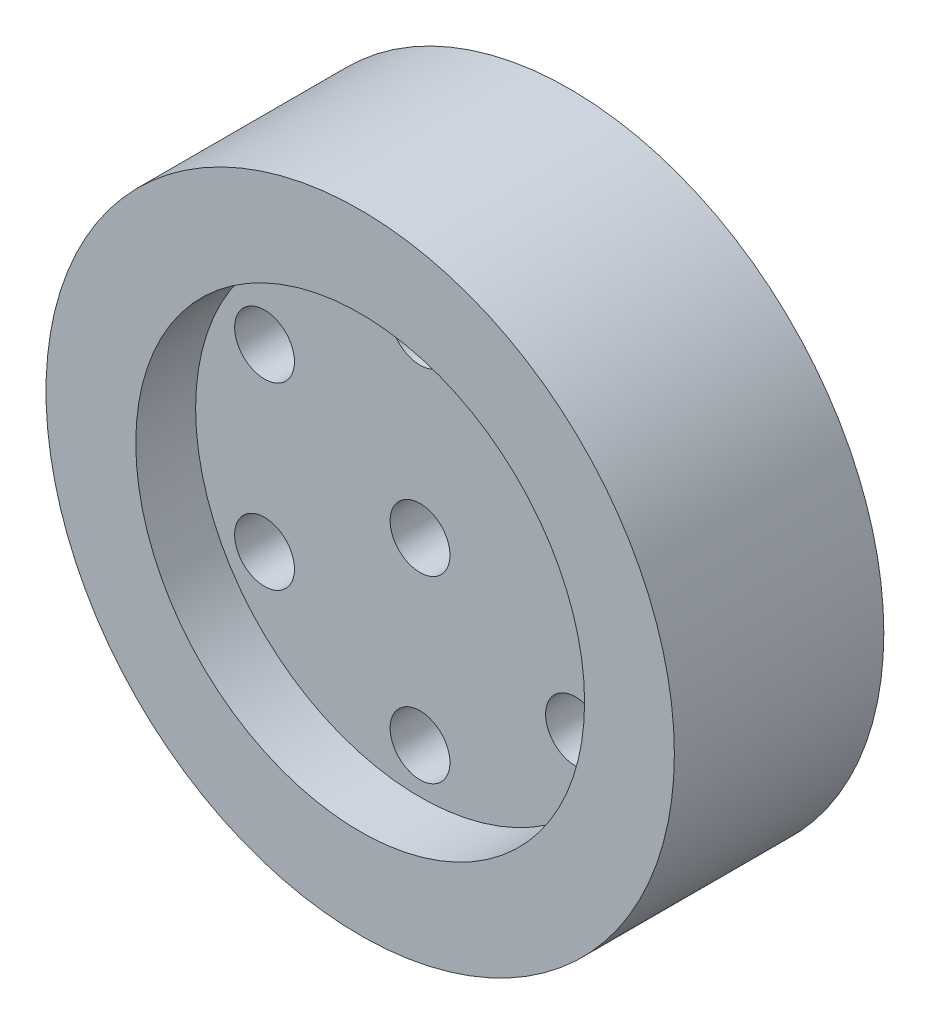
ISO-10303-21;
HEADER;
FILE_DESCRIPTION(('STEP AP214'),'2;1');
FILE_NAME('part.step','',(''),(''),'','','');
FILE_SCHEMA(('AUTOMOTIVE_DESIGN { 1 0 10303 214 1 1 1 1 }'));
ENDSEC;
DATA;
#1=APPLICATION_CONTEXT('core data for automotive mechanical design processes');
#2=APPLICATION_PROTOCOL_DEFINITION('international standard','automotive_design',2000,#1);
#3=PRODUCT_CONTEXT('',#1,'mechanical');
#4=PRODUCT('Part','Part','',(#3));
#5=PRODUCT_RELATED_PRODUCT_CATEGORY('part','',(#4));
#6=PRODUCT_DEFINITION_FORMATION('','',#4);
#7=PRODUCT_DEFINITION_CONTEXT('part definition',#1,'design');
#8=PRODUCT_DEFINITION('design','',#6,#7);
#9=PRODUCT_DEFINITION_SHAPE('','',#8);
#10=(LENGTH_UNIT() NAMED_UNIT(*) SI_UNIT(.MILLI.,.METRE.));
#11=(NAMED_UNIT(*) PLANE_ANGLE_UNIT() SI_UNIT($,.RADIAN.));
#12=(NAMED_UNIT(*) SI_UNIT($,.STERADIAN.) SOLID_ANGLE_UNIT());
#13=UNCERTAINTY_MEASURE_WITH_UNIT(LENGTH_MEASURE(1.E-05),#10,'distance_accuracy_value','');
#14=(GEOMETRIC_REPRESENTATION_CONTEXT(3) GLOBAL_UNCERTAINTY_ASSIGNED_CONTEXT((#13)) GLOBAL_UNIT_ASSIGNED_CONTEXT((#10,
#11,#12)) REPRESENTATION_CONTEXT('',''));
#15=CARTESIAN_POINT('',(0.,0.,0.));
#16=DIRECTION('',(0.,0.,1.));
#17=DIRECTION('',(1.,0.,0.));
#18=AXIS2_PLACEMENT_3D('',#15,#16,#17);
#19=CARTESIAN_POINT('',(10.3923048454134,6.0000000000003,-7.));
#20=DIRECTION('',(0.,0.,1.));
#21=DIRECTION('',(1.,0.,0.));
#22=AXIS2_PLACEMENT_3D('',#19,#20,#21);
#23=CYLINDRICAL_SURFACE('',#22,2.00000000000011);
#24=CARTESIAN_POINT('',(10.3923048454134,6.0000000000003,3.));
#25=DIRECTION('',(0.,0.,1.));
#26=DIRECTION('',(1.,0.,0.));
#27=AXIS2_PLACEMENT_3D('',#24,#25,#26);
#28=CIRCLE('',#27,2.00000000000011);
#29=CARTESIAN_POINT('',(12.3923048454135,6.0000000000003,3.));
#30=VERTEX_POINT('',#29);
#31=EDGE_CURVE('E77',#30,#30,#28,.T.);
#32=ORIENTED_EDGE('',*,*,#31,.T.);
#33=EDGE_LOOP('',(#32));
#34=FACE_BOUND('',#33,.T.);
#35=CARTESIAN_POINT('',(10.3923048454134,6.0000000000003,-3.));
#36=DIRECTION('',(0.,0.,-1.));
#37=DIRECTION('',(-1.,0.,0.));
#38=AXIS2_PLACEMENT_3D('',#35,#36,#37);
#39=CIRCLE('',#38,2.00000000000011);
#40=CARTESIAN_POINT('',(8.39230484541332,6.0000000000003,-3.));
#41=VERTEX_POINT('',#40);
#42=EDGE_CURVE('E84',#41,#41,#39,.F.);
#43=ORIENTED_EDGE('',*,*,#42,.F.);
#44=EDGE_LOOP('',(#43));
#45=FACE_BOUND('',#44,.T.);
#46=ADVANCED_FACE('F39',(#34,#45),#23,.F.);
#47=CARTESIAN_POINT('',(10.3923048454138,-5.99999999999971,-7.));
#48=DIRECTION('',(0.,0.,1.));
#49=DIRECTION('',(1.,0.,0.));
#50=AXIS2_PLACEMENT_3D('',#47,#48,#49);
#51=CYLINDRICAL_SURFACE('',#50,2.00000000000046);
#52=CARTESIAN_POINT('',(10.3923048454138,-5.99999999999971,3.));
#53=DIRECTION('',(0.,0.,1.));
#54=DIRECTION('',(1.,0.,0.));
#55=AXIS2_PLACEMENT_3D('',#52,#53,#54);
#56=CIRCLE('',#55,2.00000000000046);
#57=CARTESIAN_POINT('',(12.3923048454142,-5.99999999999971,3.));
#58=VERTEX_POINT('',#57);
#59=EDGE_CURVE('E73',#58,#58,#56,.T.);
#60=ORIENTED_EDGE('',*,*,#59,.T.);
#61=EDGE_LOOP('',(#60));
#62=FACE_BOUND('',#61,.T.);
#63=CARTESIAN_POINT('',(10.3923048454138,-5.99999999999971,-3.));
#64=DIRECTION('',(0.,0.,-1.));
#65=DIRECTION('',(-1.,0.,0.));
#66=AXIS2_PLACEMENT_3D('',#63,#64,#65);
#67=CIRCLE('',#66,2.00000000000046);
#68=CARTESIAN_POINT('',(8.39230484541332,-5.99999999999971,-3.));
#69=VERTEX_POINT('',#68);
#70=EDGE_CURVE('E91',#69,#69,#67,.F.);
#71=ORIENTED_EDGE('',*,*,#70,.F.);
#72=EDGE_LOOP('',(#71));
#73=FACE_BOUND('',#72,.T.);
#74=ADVANCED_FACE('F168',(#62,#73),#51,.F.);
#75=CARTESIAN_POINT('',(6.77712297852766E-13,-12.,-7.));
#76=DIRECTION('',(0.,0.,1.));
#77=DIRECTION('',(1.,0.,0.));
#78=AXIS2_PLACEMENT_3D('',#75,#76,#77);
#79=CYLINDRICAL_SURFACE('',#78,2.00000000000073);
#80=CARTESIAN_POINT('',(6.77712297852766E-13,-12.,3.));
#81=DIRECTION('',(0.,0.,1.));
#82=DIRECTION('',(1.,0.,0.));
#83=AXIS2_PLACEMENT_3D('',#80,#81,#82);
#84=CIRCLE('',#83,2.00000000000073);
#85=CARTESIAN_POINT('',(2.00000000000141,-12.,3.));
#86=VERTEX_POINT('',#85);
#87=EDGE_CURVE('E68',#86,#86,#84,.T.);
#88=ORIENTED_EDGE('',*,*,#87,.T.);
#89=EDGE_LOOP('',(#88));
#90=FACE_BOUND('',#89,.T.);
#91=CARTESIAN_POINT('',(6.77712297852766E-13,-12.,-3.));
#92=DIRECTION('',(0.,0.,-1.));
#93=DIRECTION('',(-1.,0.,0.));
#94=AXIS2_PLACEMENT_3D('',#91,#92,#93);
#95=CIRCLE('',#94,2.00000000000073);
#96=CARTESIAN_POINT('',(-2.00000000000005,-12.,-3.));
#97=VERTEX_POINT('',#96);
#98=EDGE_CURVE('E95',#97,#97,#95,.F.);
#99=ORIENTED_EDGE('',*,*,#98,.F.);
#100=EDGE_LOOP('',(#99));
#101=FACE_BOUND('',#100,.T.);
#102=ADVANCED_FACE('F174',(#90,#101),#79,.F.);
#103=CARTESIAN_POINT('',(-10.3923048454128,-6.0000000000003,-7.));
#104=DIRECTION('',(0.,0.,1.));
#105=DIRECTION('',(1.,0.,0.));
#106=AXIS2_PLACEMENT_3D('',#103,#104,#105);
#107=CYLINDRICAL_SURFACE('',#106,2.00000000000068);
#108=CARTESIAN_POINT('',(-10.3923048454128,-6.0000000000003,3.));
#109=DIRECTION('',(0.,0.,1.));
#110=DIRECTION('',(1.,0.,0.));
#111=AXIS2_PLACEMENT_3D('',#108,#109,#110);
#112=CIRCLE('',#111,2.00000000000068);
#113=CARTESIAN_POINT('',(-8.39230484541207,-6.0000000000003,3.));
#114=VERTEX_POINT('',#113);
#115=EDGE_CURVE('E64',#114,#114,#112,.T.);
#116=ORIENTED_EDGE('',*,*,#115,.T.);
#117=EDGE_LOOP('',(#116));
#118=FACE_BOUND('',#117,.T.);
#119=CARTESIAN_POINT('',(-10.3923048454128,-6.0000000000003,-3.));
#120=DIRECTION('',(0.,0.,-1.));
#121=DIRECTION('',(-1.,0.,0.));
#122=AXIS2_PLACEMENT_3D('',#119,#120,#121);
#123=CIRCLE('',#122,2.00000000000068);
#124=CARTESIAN_POINT('',(-12.3923048454134,-6.0000000000003,-3.));
#125=VERTEX_POINT('',#124);
#126=EDGE_CURVE('E99',#125,#125,#123,.F.);
#127=ORIENTED_EDGE('',*,*,#126,.F.);
#128=EDGE_LOOP('',(#127));
#129=FACE_BOUND('',#128,.T.);
#130=ADVANCED_FACE('F183',(#118,#129),#107,.F.);
#131=CARTESIAN_POINT('',(-10.3923048454131,5.9999999999997,-7.));
#132=DIRECTION('',(0.,0.,1.));
#133=DIRECTION('',(1.,0.,0.));
#134=AXIS2_PLACEMENT_3D('',#131,#132,#133);
#135=CYLINDRICAL_SURFACE('',#134,2.00000000000039);
#136=CARTESIAN_POINT('',(-10.3923048454131,5.9999999999997,3.));
#137=DIRECTION('',(0.,0.,1.));
#138=DIRECTION('',(1.,0.,0.));
#139=AXIS2_PLACEMENT_3D('',#136,#137,#138);
#140=CIRCLE('',#139,2.00000000000039);
#141=CARTESIAN_POINT('',(-8.39230484541271,5.9999999999997,3.));
#142=VERTEX_POINT('',#141);
#143=EDGE_CURVE('E69',#142,#142,#140,.T.);
#144=ORIENTED_EDGE('',*,*,#143,.T.);
#145=EDGE_LOOP('',(#144));
#146=FACE_BOUND('',#145,.T.);
#147=CARTESIAN_POINT('',(-10.3923048454131,5.9999999999997,-3.));
#148=DIRECTION('',(0.,0.,-1.));
#149=DIRECTION('',(-1.,0.,0.));
#150=AXIS2_PLACEMENT_3D('',#147,#148,#149);
#151=CIRCLE('',#150,2.00000000000039);
#152=CARTESIAN_POINT('',(-12.3923048454135,5.9999999999997,-3.));
#153=VERTEX_POINT('',#152);
#154=EDGE_CURVE('E103',#153,#153,#151,.F.);
#155=ORIENTED_EDGE('',*,*,#154,.F.);
#156=EDGE_LOOP('',(#155));
#157=FACE_BOUND('',#156,.T.);
#158=ADVANCED_FACE('F178',(#146,#157),#135,.F.);
#159=CARTESIAN_POINT('',(0.,12.,-7.));
#160=DIRECTION('',(0.,0.,1.));
#161=DIRECTION('',(1.,0.,0.));
#162=AXIS2_PLACEMENT_3D('',#159,#160,#161);
#163=CYLINDRICAL_SURFACE('',#162,2.);
#164=CARTESIAN_POINT('',(0.,12.,3.));
#165=DIRECTION('',(0.,0.,1.));
#166=DIRECTION('',(1.,0.,0.));
#167=AXIS2_PLACEMENT_3D('',#164,#165,#166);
#168=CIRCLE('',#167,2.);
#169=CARTESIAN_POINT('',(2.,12.,3.));
#170=VERTEX_POINT('',#169);
#171=EDGE_CURVE('E60',#170,#170,#168,.T.);
#172=ORIENTED_EDGE('',*,*,#171,.T.);
#173=EDGE_LOOP('',(#172));
#174=FACE_BOUND('',#173,.T.);
#175=CARTESIAN_POINT('',(0.,12.,-3.));
#176=DIRECTION('',(0.,0.,-1.));
#177=DIRECTION('',(-1.,0.,0.));
#178=AXIS2_PLACEMENT_3D('',#175,#176,#177);
#179=CIRCLE('',#178,2.);
#180=CARTESIAN_POINT('',(-2.,12.,-3.));
#181=VERTEX_POINT('',#180);
#182=EDGE_CURVE('E43',#181,#181,#179,.F.);
#183=ORIENTED_EDGE('',*,*,#182,.F.);
#184=EDGE_LOOP('',(#183));
#185=FACE_BOUND('',#184,.T.);
#186=ADVANCED_FACE('F208',(#174,#185),#163,.F.);
#187=CARTESIAN_POINT('',(0.,0.,7.));
#188=DIRECTION('',(0.,0.,-1.));
#189=DIRECTION('',(-1.,0.,0.));
#190=AXIS2_PLACEMENT_3D('',#187,#188,#189);
#191=CYLINDRICAL_SURFACE('',#190,21.);
#192=CARTESIAN_POINT('',(0.,0.,7.));
#193=DIRECTION('',(0.,0.,1.));
#194=DIRECTION('',(1.,0.,0.));
#195=AXIS2_PLACEMENT_3D('',#192,#193,#194);
#196=CIRCLE('',#195,21.);
#197=CARTESIAN_POINT('',(21.,0.,7.));
#198=VERTEX_POINT('',#197);
#199=EDGE_CURVE('E10',#198,#198,#196,.T.);
#200=ORIENTED_EDGE('',*,*,#199,.F.);
#201=EDGE_LOOP('',(#200));
#202=FACE_BOUND('',#201,.T.);
#203=CARTESIAN_POINT('',(0.,0.,-7.));
#204=DIRECTION('',(0.,0.,1.));
#205=DIRECTION('',(1.,0.,0.));
#206=AXIS2_PLACEMENT_3D('',#203,#204,#205);
#207=CIRCLE('',#206,21.);
#208=CARTESIAN_POINT('',(21.,0.,-7.));
#209=VERTEX_POINT('',#208);
#210=EDGE_CURVE('E48',#209,#209,#207,.T.);
#211=ORIENTED_EDGE('',*,*,#210,.T.);
#212=EDGE_LOOP('',(#211));
#213=FACE_BOUND('',#212,.T.);
#214=ADVANCED_FACE('F41',(#202,#213),#191,.T.);
#215=CARTESIAN_POINT('',(0.,0.,7.));
#216=DIRECTION('',(0.,0.,1.));
#217=DIRECTION('',(1.,0.,0.));
#218=AXIS2_PLACEMENT_3D('',#215,#216,#217);
#219=PLANE('',#218);
#220=CARTESIAN_POINT('',(0.,0.,7.));
#221=DIRECTION('',(0.,0.,1.));
#222=DIRECTION('',(1.,0.,0.));
#223=AXIS2_PLACEMENT_3D('',#220,#221,#222);
#224=CIRCLE('',#223,15.);
#225=CARTESIAN_POINT('',(15.,0.,7.));
#226=VERTEX_POINT('',#225);
#227=EDGE_CURVE('E56',#226,#226,#224,.T.);
#228=ORIENTED_EDGE('',*,*,#227,.F.);
#229=EDGE_LOOP('',(#228));
#230=FACE_BOUND('',#229,.T.);
#231=ORIENTED_EDGE('',*,*,#199,.T.);
#232=EDGE_LOOP('',(#231));
#233=FACE_BOUND('',#232,.T.);
#234=ADVANCED_FACE('F196',(#230,#233),#219,.T.);
#235=CARTESIAN_POINT('',(0.,0.,-7.));
#236=DIRECTION('',(0.,0.,1.));
#237=DIRECTION('',(1.,0.,0.));
#238=AXIS2_PLACEMENT_3D('',#235,#236,#237);
#239=PLANE('',#238);
#240=CARTESIAN_POINT('',(0.,0.,-7.));
#241=DIRECTION('',(0.,0.,-1.));
#242=DIRECTION('',(-1.,0.,0.));
#243=AXIS2_PLACEMENT_3D('',#240,#241,#242);
#244=CIRCLE('',#243,19.);
#245=CARTESIAN_POINT('',(-19.,0.,-7.));
#246=VERTEX_POINT('',#245);
#247=EDGE_CURVE('E107',#246,#246,#244,.T.);
#248=ORIENTED_EDGE('',*,*,#247,.F.);
#249=EDGE_LOOP('',(#248));
#250=FACE_BOUND('',#249,.T.);
#251=ORIENTED_EDGE('',*,*,#210,.F.);
#252=EDGE_LOOP('',(#251));
#253=FACE_BOUND('',#252,.T.);
#254=ADVANCED_FACE('F194',(#250,#253),#239,.F.);
#255=CARTESIAN_POINT('',(0.,0.,3.));
#256=DIRECTION('',(0.,0.,1.));
#257=DIRECTION('',(1.,0.,0.));
#258=AXIS2_PLACEMENT_3D('',#255,#256,#257);
#259=CYLINDRICAL_SURFACE('',#258,15.);
#260=CARTESIAN_POINT('',(0.,0.,3.));
#261=DIRECTION('',(0.,0.,1.));
#262=DIRECTION('',(1.,0.,0.));
#263=AXIS2_PLACEMENT_3D('',#260,#261,#262);
#264=CIRCLE('',#263,15.);
#265=CARTESIAN_POINT('',(15.,0.,3.));
#266=VERTEX_POINT('',#265);
#267=EDGE_CURVE('E54',#266,#266,#264,.T.);
#268=ORIENTED_EDGE('',*,*,#267,.F.);
#269=EDGE_LOOP('',(#268));
#270=FACE_BOUND('',#269,.T.);
#271=ORIENTED_EDGE('',*,*,#227,.T.);
#272=EDGE_LOOP('',(#271));
#273=FACE_BOUND('',#272,.T.);
#274=ADVANCED_FACE('F190',(#270,#273),#259,.F.);
#275=CARTESIAN_POINT('',(0.,0.,3.));
#276=DIRECTION('',(0.,0.,1.));
#277=DIRECTION('',(1.,0.,0.));
#278=AXIS2_PLACEMENT_3D('',#275,#276,#277);
#279=PLANE('',#278);
#280=CARTESIAN_POINT('',(0.,0.,3.));
#281=DIRECTION('',(0.,0.,1.));
#282=DIRECTION('',(1.,0.,0.));
#283=AXIS2_PLACEMENT_3D('',#280,#281,#282);
#284=CIRCLE('',#283,2.);
#285=CARTESIAN_POINT('',(2.,0.,3.));
#286=VERTEX_POINT('',#285);
#287=EDGE_CURVE('E123',#286,#286,#284,.T.);
#288=ORIENTED_EDGE('',*,*,#287,.F.);
#289=EDGE_LOOP('',(#288));
#290=FACE_BOUND('',#289,.T.);
#291=ORIENTED_EDGE('',*,*,#171,.F.);
#292=EDGE_LOOP('',(#291));
#293=FACE_BOUND('',#292,.T.);
#294=ORIENTED_EDGE('',*,*,#143,.F.);
#295=EDGE_LOOP('',(#294));
#296=FACE_BOUND('',#295,.T.);
#297=ORIENTED_EDGE('',*,*,#115,.F.);
#298=EDGE_LOOP('',(#297));
#299=FACE_BOUND('',#298,.T.);
#300=ORIENTED_EDGE('',*,*,#87,.F.);
#301=EDGE_LOOP('',(#300));
#302=FACE_BOUND('',#301,.T.);
#303=ORIENTED_EDGE('',*,*,#59,.F.);
#304=EDGE_LOOP('',(#303));
#305=FACE_BOUND('',#304,.T.);
#306=ORIENTED_EDGE('',*,*,#31,.F.);
#307=EDGE_LOOP('',(#306));
#308=FACE_BOUND('',#307,.T.);
#309=ORIENTED_EDGE('',*,*,#267,.T.);
#310=EDGE_LOOP('',(#309));
#311=FACE_BOUND('',#310,.T.);
#312=ADVANCED_FACE('F150',(#290,#293,#296,#299,#302,#305,#308,#311),#279,.T.);
#313=CARTESIAN_POINT('',(0.,0.,-3.));
#314=DIRECTION('',(0.,0.,-1.));
#315=DIRECTION('',(-1.,0.,0.));
#316=AXIS2_PLACEMENT_3D('',#313,#314,#315);
#317=PLANE('',#316);
#318=CARTESIAN_POINT('',(0.,0.,-3.));
#319=DIRECTION('',(0.,0.,-1.));
#320=DIRECTION('',(-1.,0.,0.));
#321=AXIS2_PLACEMENT_3D('',#318,#319,#320);
#322=CIRCLE('',#321,5.);
#323=CARTESIAN_POINT('',(-5.,0.,-3.));
#324=VERTEX_POINT('',#323);
#325=EDGE_CURVE('E119',#324,#324,#322,.T.);
#326=ORIENTED_EDGE('',*,*,#325,.F.);
#327=EDGE_LOOP('',(#326));
#328=FACE_BOUND('',#327,.T.);
#329=CARTESIAN_POINT('',(0.,0.,-3.));
#330=DIRECTION('',(0.,0.,-1.));
#331=DIRECTION('',(-1.,0.,0.));
#332=AXIS2_PLACEMENT_3D('',#329,#330,#331);
#333=CIRCLE('',#332,19.);
#334=CARTESIAN_POINT('',(-19.,0.,-3.));
#335=VERTEX_POINT('',#334);
#336=EDGE_CURVE('E111',#335,#335,#333,.T.);
#337=ORIENTED_EDGE('',*,*,#336,.T.);
#338=EDGE_LOOP('',(#337));
#339=FACE_BOUND('',#338,.T.);
#340=ORIENTED_EDGE('',*,*,#182,.T.);
#341=EDGE_LOOP('',(#340));
#342=FACE_BOUND('',#341,.T.);
#343=ORIENTED_EDGE('',*,*,#154,.T.);
#344=EDGE_LOOP('',(#343));
#345=FACE_BOUND('',#344,.T.);
#346=ORIENTED_EDGE('',*,*,#126,.T.);
#347=EDGE_LOOP('',(#346));
#348=FACE_BOUND('',#347,.T.);
#349=ORIENTED_EDGE('',*,*,#98,.T.);
#350=EDGE_LOOP('',(#349));
#351=FACE_BOUND('',#350,.T.);
#352=ORIENTED_EDGE('',*,*,#70,.T.);
#353=EDGE_LOOP('',(#352));
#354=FACE_BOUND('',#353,.T.);
#355=ORIENTED_EDGE('',*,*,#42,.T.);
#356=EDGE_LOOP('',(#355));
#357=FACE_BOUND('',#356,.T.);
#358=ADVANCED_FACE('F147',(#328,#339,#342,#345,#348,#351,#354,#357),#317,.T.);
#359=CARTESIAN_POINT('',(0.,0.,-3.));
#360=DIRECTION('',(0.,0.,-1.));
#361=DIRECTION('',(-1.,0.,0.));
#362=AXIS2_PLACEMENT_3D('',#359,#360,#361);
#363=CYLINDRICAL_SURFACE('',#362,19.);
#364=ORIENTED_EDGE('',*,*,#336,.F.);
#365=EDGE_LOOP('',(#364));
#366=FACE_BOUND('',#365,.T.);
#367=ORIENTED_EDGE('',*,*,#247,.T.);
#368=EDGE_LOOP('',(#367));
#369=FACE_BOUND('',#368,.T.);
#370=ADVANCED_FACE('F143',(#366,#369),#363,.F.);
#371=CARTESIAN_POINT('',(0.,0.,-21.1421356237309));
#372=DIRECTION('',(0.,0.,1.));
#373=DIRECTION('',(1.,0.,0.));
#374=AXIS2_PLACEMENT_3D('',#371,#372,#373);
#375=CYLINDRICAL_SURFACE('',#374,5.);
#376=CARTESIAN_POINT('',(0.,0.,-7.));
#377=DIRECTION('',(0.,0.,1.));
#378=DIRECTION('',(1.,0.,0.));
#379=AXIS2_PLACEMENT_3D('',#376,#377,#378);
#380=CIRCLE('',#379,5.);
#381=CARTESIAN_POINT('',(5.,0.,-7.));
#382=VERTEX_POINT('',#381);
#383=EDGE_CURVE('E112',#382,#382,#380,.T.);
#384=ORIENTED_EDGE('',*,*,#383,.T.);
#385=EDGE_LOOP('',(#384));
#386=FACE_BOUND('',#385,.T.);
#387=ORIENTED_EDGE('',*,*,#325,.T.);
#388=EDGE_LOOP('',(#387));
#389=FACE_BOUND('',#388,.T.);
#390=ADVANCED_FACE('F137',(#386,#389),#375,.T.);
#391=CARTESIAN_POINT('',(0.,0.,-7.));
#392=DIRECTION('',(0.,0.,1.));
#393=DIRECTION('',(1.,0.,0.));
#394=AXIS2_PLACEMENT_3D('',#391,#392,#393);
#395=PLANE('',#394);
#396=CARTESIAN_POINT('',(0.,0.,-7.));
#397=DIRECTION('',(0.,0.,-1.));
#398=DIRECTION('',(-1.,0.,0.));
#399=AXIS2_PLACEMENT_3D('',#396,#397,#398);
#400=CIRCLE('',#399,2.);
#401=CARTESIAN_POINT('',(-2.,0.,-7.));
#402=VERTEX_POINT('',#401);
#403=EDGE_CURVE('E127',#402,#402,#400,.T.);
#404=ORIENTED_EDGE('',*,*,#403,.F.);
#405=EDGE_LOOP('',(#404));
#406=FACE_BOUND('',#405,.T.);
#407=ORIENTED_EDGE('',*,*,#383,.F.);
#408=EDGE_LOOP('',(#407));
#409=FACE_BOUND('',#408,.T.);
#410=ADVANCED_FACE('F134',(#406,#409),#395,.F.);
#411=CARTESIAN_POINT('',(0.,0.,7.));
#412=DIRECTION('',(0.,0.,-1.));
#413=DIRECTION('',(-1.,0.,0.));
#414=AXIS2_PLACEMENT_3D('',#411,#412,#413);
#415=CYLINDRICAL_SURFACE('',#414,2.);
#416=ORIENTED_EDGE('',*,*,#287,.T.);
#417=EDGE_LOOP('',(#416));
#418=FACE_BOUND('',#417,.T.);
#419=ORIENTED_EDGE('',*,*,#403,.T.);
#420=EDGE_LOOP('',(#419));
#421=FACE_BOUND('',#420,.T.);
#422=ADVANCED_FACE('F132',(#418,#421),#415,.F.);
#423=CLOSED_SHELL('',(#46,#74,#102,#130,#158,#186,#214,#234,#254,#274,#312,#358,#370,#390,#410,#422));
#424=MANIFOLD_SOLID_BREP('B2',#423);
#425=ADVANCED_BREP_SHAPE_REPRESENTATION('',(#18,#424),#14);
#426=SHAPE_DEFINITION_REPRESENTATION(#9,#425);
ENDSEC;
END-ISO-10303-21;
